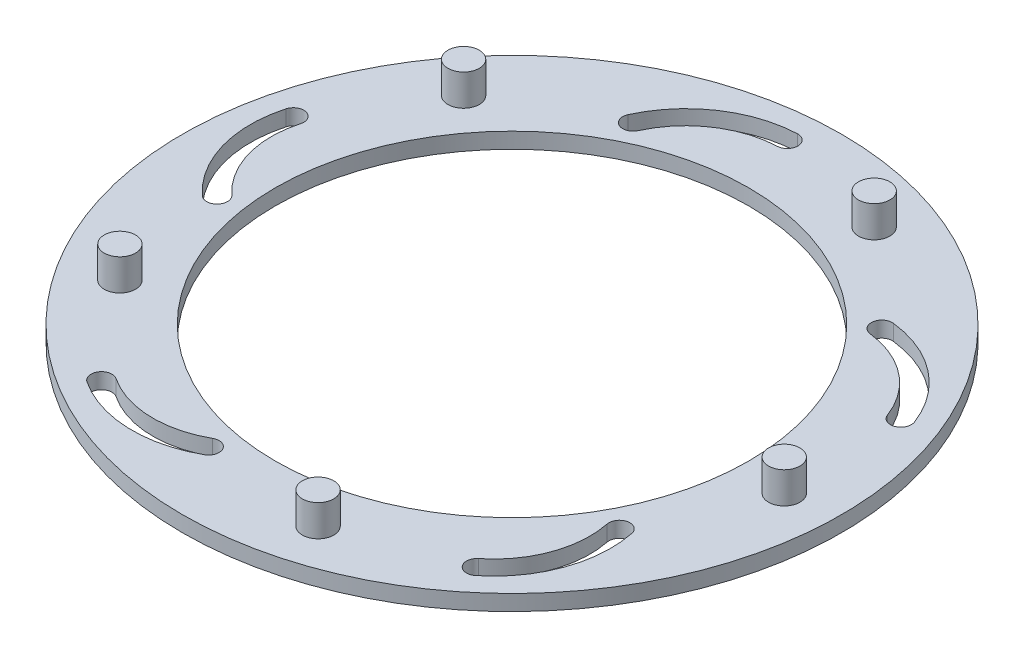
ISO-10303-21;
HEADER;
FILE_DESCRIPTION(('STEP AP214'),'2;1');
FILE_NAME('part.step','',(''),(''),'','','');
FILE_SCHEMA(('AUTOMOTIVE_DESIGN { 1 0 10303 214 1 1 1 1 }'));
ENDSEC;
DATA;
#1=APPLICATION_CONTEXT('core data for automotive mechanical design processes');
#2=APPLICATION_PROTOCOL_DEFINITION('international standard','automotive_design',2000,#1);
#3=PRODUCT_CONTEXT('',#1,'mechanical');
#4=PRODUCT('Part','Part','',(#3));
#5=PRODUCT_RELATED_PRODUCT_CATEGORY('part','',(#4));
#6=PRODUCT_DEFINITION_FORMATION('','',#4);
#7=PRODUCT_DEFINITION_CONTEXT('part definition',#1,'design');
#8=PRODUCT_DEFINITION('design','',#6,#7);
#9=PRODUCT_DEFINITION_SHAPE('','',#8);
#10=(LENGTH_UNIT() NAMED_UNIT(*) SI_UNIT(.MILLI.,.METRE.));
#11=(NAMED_UNIT(*) PLANE_ANGLE_UNIT() SI_UNIT($,.RADIAN.));
#12=(NAMED_UNIT(*) SI_UNIT($,.STERADIAN.) SOLID_ANGLE_UNIT());
#13=UNCERTAINTY_MEASURE_WITH_UNIT(LENGTH_MEASURE(1.E-05),#10,'distance_accuracy_value','');
#14=(GEOMETRIC_REPRESENTATION_CONTEXT(3) GLOBAL_UNCERTAINTY_ASSIGNED_CONTEXT((#13)) GLOBAL_UNIT_ASSIGNED_CONTEXT((#10,
#11,#12)) REPRESENTATION_CONTEXT('',''));
#15=CARTESIAN_POINT('',(0.,0.,0.));
#16=DIRECTION('',(0.,0.,1.));
#17=DIRECTION('',(1.,0.,0.));
#18=AXIS2_PLACEMENT_3D('',#15,#16,#17);
#19=CARTESIAN_POINT('',(-17.9080700913482,1.5,-4.05608746272835));
#20=DIRECTION('',(0.,-1.,0.));
#21=DIRECTION('',(0.,0.,-1.));
#22=AXIS2_PLACEMENT_3D('',#19,#20,#21);
#23=CYLINDRICAL_SURFACE('',#22,11.1486503347922);
#24=CARTESIAN_POINT('',(-17.9080700913482,0.,-4.05608746272835));
#25=DIRECTION('',(0.,1.,0.));
#26=DIRECTION('',(0.,0.,1.));
#27=AXIS2_PLACEMENT_3D('',#24,#25,#26);
#28=CIRCLE('',#27,11.1486503347922);
#29=CARTESIAN_POINT('',(-25.4396115620862,0.,4.16390568580991));
#30=VERTEX_POINT('',#29);
#31=CARTESIAN_POINT('',(-28.6472570750459,0.,-7.04979206015291));
#32=VERTEX_POINT('',#31);
#33=EDGE_CURVE('E288',#30,#32,#28,.F.);
#34=ORIENTED_EDGE('',*,*,#33,.T.);
#35=DIRECTION('',(0.,-1.,0.));
#36=VECTOR('',#35,1.);
#37=CARTESIAN_POINT('',(-28.6472570750459,1.5,-7.04979206015291));
#38=LINE('',#37,#36);
#39=CARTESIAN_POINT('',(-28.6472570750459,1.5,-7.04979206015291));
#40=VERTEX_POINT('',#39);
#41=EDGE_CURVE('E11',#40,#32,#38,.T.);
#42=ORIENTED_EDGE('',*,*,#41,.F.);
#43=CARTESIAN_POINT('',(-17.9080700913482,1.5,-4.05608746272835));
#44=DIRECTION('',(0.,1.,0.));
#45=DIRECTION('',(0.,0.,1.));
#46=AXIS2_PLACEMENT_3D('',#43,#44,#45);
#47=CIRCLE('',#46,11.1486503347922);
#48=CARTESIAN_POINT('',(-25.4396115620862,1.5,4.16390568580991));
#49=VERTEX_POINT('',#48);
#50=EDGE_CURVE('E194',#49,#40,#47,.F.);
#51=ORIENTED_EDGE('',*,*,#50,.F.);
#52=DIRECTION('',(0.,-1.,0.));
#53=VECTOR('',#52,1.);
#54=CARTESIAN_POINT('',(-25.4396115620862,1.5,4.16390568580991));
#55=LINE('',#54,#53);
#56=EDGE_CURVE('E61',#49,#30,#55,.T.);
#57=ORIENTED_EDGE('',*,*,#56,.T.);
#58=EDGE_LOOP('',(#34,#42,#51,#57));
#59=FACE_BOUND('',#58,.T.);
#60=ADVANCED_FACE('F41',(#59),#23,.F.);
#61=CARTESIAN_POINT('',(-27.6839846912863,1.5,-6.78126587020847));
#62=DIRECTION('',(0.,-1.,0.));
#63=DIRECTION('',(0.,0.,-1.));
#64=AXIS2_PLACEMENT_3D('',#61,#62,#63);
#65=CYLINDRICAL_SURFACE('',#64,1.);
#66=CARTESIAN_POINT('',(-27.6839846912863,0.,-6.78126587020847));
#67=DIRECTION('',(0.,1.,0.));
#68=DIRECTION('',(0.,0.,1.));
#69=AXIS2_PLACEMENT_3D('',#66,#67,#68);
#70=CIRCLE('',#69,1.);
#71=CARTESIAN_POINT('',(-26.7207123075267,0.,-6.51273968026403));
#72=VERTEX_POINT('',#71);
#73=EDGE_CURVE('E201',#32,#72,#70,.F.);
#74=ORIENTED_EDGE('',*,*,#73,.T.);
#75=DIRECTION('',(0.,-1.,0.));
#76=VECTOR('',#75,1.);
#77=CARTESIAN_POINT('',(-26.7207123075267,1.5,-6.51273968026403));
#78=LINE('',#77,#76);
#79=CARTESIAN_POINT('',(-26.7207123075267,1.5,-6.51273968026403));
#80=VERTEX_POINT('',#79);
#81=EDGE_CURVE('E52',#80,#72,#78,.T.);
#82=ORIENTED_EDGE('',*,*,#81,.F.);
#83=CARTESIAN_POINT('',(-27.6839846912863,1.5,-6.78126587020847));
#84=DIRECTION('',(0.,1.,0.));
#85=DIRECTION('',(0.,0.,1.));
#86=AXIS2_PLACEMENT_3D('',#83,#84,#85);
#87=CIRCLE('',#86,1.);
#88=EDGE_CURVE('E188',#40,#80,#87,.F.);
#89=ORIENTED_EDGE('',*,*,#88,.F.);
#90=ORIENTED_EDGE('',*,*,#41,.T.);
#91=EDGE_LOOP('',(#74,#82,#89,#90));
#92=FACE_BOUND('',#91,.T.);
#93=ADVANCED_FACE('F200',(#92),#65,.F.);
#94=CARTESIAN_POINT('',(-17.9080700913482,1.5,-4.05608746272835));
#95=DIRECTION('',(0.,-1.,0.));
#96=DIRECTION('',(0.,0.,-1.));
#97=AXIS2_PLACEMENT_3D('',#94,#95,#96);
#98=CYLINDRICAL_SURFACE('',#97,9.1486503347922);
#99=CARTESIAN_POINT('',(-17.9080700913482,0.,-4.05608746272835));
#100=DIRECTION('',(0.,1.,0.));
#101=DIRECTION('',(0.,0.,1.));
#102=AXIS2_PLACEMENT_3D('',#99,#100,#101);
#103=CIRCLE('',#102,9.1486503347922);
#104=CARTESIAN_POINT('',(-24.0884988722867,0.,2.68928895612637));
#105=VERTEX_POINT('',#104);
#106=EDGE_CURVE('E293',#105,#72,#103,.F.);
#107=ORIENTED_EDGE('',*,*,#106,.F.);
#108=DIRECTION('',(0.,-1.,0.));
#109=VECTOR('',#108,1.);
#110=CARTESIAN_POINT('',(-24.0884988722867,1.5,2.68928895612637));
#111=LINE('',#110,#109);
#112=CARTESIAN_POINT('',(-24.0884988722867,1.5,2.68928895612637));
#113=VERTEX_POINT('',#112);
#114=EDGE_CURVE('E123',#113,#105,#111,.T.);
#115=ORIENTED_EDGE('',*,*,#114,.F.);
#116=CARTESIAN_POINT('',(-17.9080700913482,1.5,-4.05608746272835));
#117=DIRECTION('',(0.,1.,0.));
#118=DIRECTION('',(0.,0.,1.));
#119=AXIS2_PLACEMENT_3D('',#116,#117,#118);
#120=CIRCLE('',#119,9.1486503347922);
#121=EDGE_CURVE('E193',#113,#80,#120,.F.);
#122=ORIENTED_EDGE('',*,*,#121,.T.);
#123=ORIENTED_EDGE('',*,*,#81,.T.);
#124=EDGE_LOOP('',(#107,#115,#122,#123));
#125=FACE_BOUND('',#124,.T.);
#126=ADVANCED_FACE('F206',(#125),#98,.T.);
#127=CARTESIAN_POINT('',(-9.39146640677339,1.5,15.7781867979949));
#128=DIRECTION('',(0.,-1.,0.));
#129=DIRECTION('',(0.,0.,-1.));
#130=AXIS2_PLACEMENT_3D('',#127,#128,#129);
#131=CYLINDRICAL_SURFACE('',#130,11.1486503347922);
#132=CARTESIAN_POINT('',(-9.39146640677339,0.,15.7781867979949));
#133=DIRECTION('',(0.,1.,0.));
#134=DIRECTION('',(0.,0.,1.));
#135=AXIS2_PLACEMENT_3D('',#132,#133,#134);
#136=CIRCLE('',#135,11.1486503347922);
#137=CARTESIAN_POINT('',(-3.90116266725228,0.,25.4812259680315));
#138=VERTEX_POINT('',#137);
#139=CARTESIAN_POINT('',(-15.5572399557496,0.,25.0666549618101));
#140=VERTEX_POINT('',#139);
#141=EDGE_CURVE('E272',#138,#140,#136,.F.);
#142=ORIENTED_EDGE('',*,*,#141,.T.);
#143=DIRECTION('',(0.,-1.,0.));
#144=VECTOR('',#143,1.);
#145=CARTESIAN_POINT('',(-15.5572399557496,1.5,25.0666549618101));
#146=LINE('',#145,#144);
#147=CARTESIAN_POINT('',(-15.5572399557496,1.5,25.0666549618101));
#148=VERTEX_POINT('',#147);
#149=EDGE_CURVE('E303',#148,#140,#146,.T.);
#150=ORIENTED_EDGE('',*,*,#149,.F.);
#151=CARTESIAN_POINT('',(-9.39146640677339,1.5,15.7781867979949));
#152=DIRECTION('',(0.,1.,0.));
#153=DIRECTION('',(0.,0.,1.));
#154=AXIS2_PLACEMENT_3D('',#151,#152,#153);
#155=CIRCLE('',#154,11.1486503347922);
#156=CARTESIAN_POINT('',(-3.90116266725228,1.5,25.4812259680315));
#157=VERTEX_POINT('',#156);
#158=EDGE_CURVE('E781',#157,#148,#155,.F.);
#159=ORIENTED_EDGE('',*,*,#158,.F.);
#160=DIRECTION('',(0.,-1.,0.));
#161=VECTOR('',#160,1.);
#162=CARTESIAN_POINT('',(-3.90116266725228,1.5,25.4812259680315));
#163=LINE('',#162,#161);
#164=EDGE_CURVE('E306',#157,#138,#163,.T.);
#165=ORIENTED_EDGE('',*,*,#164,.T.);
#166=EDGE_LOOP('',(#142,#150,#159,#165));
#167=FACE_BOUND('',#166,.T.);
#168=ADVANCED_FACE('F399',(#167),#131,.F.);
#169=CARTESIAN_POINT('',(-15.0041888362132,1.5,24.2335076403959));
#170=DIRECTION('',(0.,-1.,0.));
#171=DIRECTION('',(0.,0.,-1.));
#172=AXIS2_PLACEMENT_3D('',#169,#170,#171);
#173=CYLINDRICAL_SURFACE('',#172,1.);
#174=CARTESIAN_POINT('',(-15.0041888362132,0.,24.2335076403959));
#175=DIRECTION('',(0.,1.,0.));
#176=DIRECTION('',(0.,0.,1.));
#177=AXIS2_PLACEMENT_3D('',#174,#175,#176);
#178=CIRCLE('',#177,1.);
#179=CARTESIAN_POINT('',(-14.4511377166769,0.,23.4003603189818));
#180=VERTEX_POINT('',#179);
#181=EDGE_CURVE('E276',#140,#180,#178,.F.);
#182=ORIENTED_EDGE('',*,*,#181,.T.);
#183=DIRECTION('',(0.,-1.,0.));
#184=VECTOR('',#183,1.);
#185=CARTESIAN_POINT('',(-14.4511377166769,1.5,23.4003603189818));
#186=LINE('',#185,#184);
#187=CARTESIAN_POINT('',(-14.4511377166769,1.5,23.4003603189818));
#188=VERTEX_POINT('',#187);
#189=EDGE_CURVE('E313',#188,#180,#186,.T.);
#190=ORIENTED_EDGE('',*,*,#189,.F.);
#191=CARTESIAN_POINT('',(-15.0041888362132,1.5,24.2335076403959));
#192=DIRECTION('',(0.,1.,0.));
#193=DIRECTION('',(0.,0.,1.));
#194=AXIS2_PLACEMENT_3D('',#191,#192,#193);
#195=CIRCLE('',#194,1.);
#196=EDGE_CURVE('E785',#148,#188,#195,.F.);
#197=ORIENTED_EDGE('',*,*,#196,.F.);
#198=ORIENTED_EDGE('',*,*,#149,.T.);
#199=EDGE_LOOP('',(#182,#190,#197,#198));
#200=FACE_BOUND('',#199,.T.);
#201=ADVANCED_FACE('F395',(#200),#173,.F.);
#202=CARTESIAN_POINT('',(-9.39146640677339,1.5,15.7781867979949));
#203=DIRECTION('',(0.,-1.,0.));
#204=DIRECTION('',(0.,0.,-1.));
#205=AXIS2_PLACEMENT_3D('',#202,#203,#204);
#206=CYLINDRICAL_SURFACE('',#205,9.1486503347922);
#207=CARTESIAN_POINT('',(-9.39146640677339,0.,15.7781867979949));
#208=DIRECTION('',(0.,1.,0.));
#209=DIRECTION('',(0.,0.,1.));
#210=AXIS2_PLACEMENT_3D('',#207,#208,#209);
#211=CIRCLE('',#210,9.1486503347922);
#212=CARTESIAN_POINT('',(-4.88608973459195,0.,23.7405598104867));
#213=VERTEX_POINT('',#212);
#214=EDGE_CURVE('E280',#213,#180,#211,.F.);
#215=ORIENTED_EDGE('',*,*,#214,.F.);
#216=DIRECTION('',(0.,-1.,0.));
#217=VECTOR('',#216,1.);
#218=CARTESIAN_POINT('',(-4.88608973459195,1.5,23.7405598104867));
#219=LINE('',#218,#217);
#220=CARTESIAN_POINT('',(-4.88608973459195,1.5,23.7405598104867));
#221=VERTEX_POINT('',#220);
#222=EDGE_CURVE('E309',#221,#213,#219,.T.);
#223=ORIENTED_EDGE('',*,*,#222,.F.);
#224=CARTESIAN_POINT('',(-9.39146640677339,1.5,15.7781867979949));
#225=DIRECTION('',(0.,1.,0.));
#226=DIRECTION('',(0.,0.,1.));
#227=AXIS2_PLACEMENT_3D('',#224,#225,#226);
#228=CIRCLE('',#227,9.1486503347922);
#229=EDGE_CURVE('E788',#221,#188,#228,.F.);
#230=ORIENTED_EDGE('',*,*,#229,.T.);
#231=ORIENTED_EDGE('',*,*,#189,.T.);
#232=EDGE_LOOP('',(#215,#223,#230,#231));
#233=FACE_BOUND('',#232,.T.);
#234=ADVANCED_FACE('F391',(#233),#206,.T.);
#235=CARTESIAN_POINT('',(12.1038246477627,1.5,13.8075431847338));
#236=DIRECTION('',(0.,-1.,0.));
#237=DIRECTION('',(0.,0.,-1.));
#238=AXIS2_PLACEMENT_3D('',#235,#236,#237);
#239=CYLINDRICAL_SURFACE('',#238,11.1486503347922);
#240=CARTESIAN_POINT('',(12.1038246477627,0.,13.8075431847338));
#241=DIRECTION('',(0.,1.,0.));
#242=DIRECTION('',(0.,0.,1.));
#243=AXIS2_PLACEMENT_3D('',#240,#241,#242);
#244=CIRCLE('',#243,11.1486503347922);
#245=CARTESIAN_POINT('',(23.0285604380854,0.,11.5843580374497));
#246=VERTEX_POINT('',#245);
#247=CARTESIAN_POINT('',(19.032354011258,0.,22.5418368108175));
#248=VERTEX_POINT('',#247);
#249=EDGE_CURVE('E256',#246,#248,#244,.F.);
#250=ORIENTED_EDGE('',*,*,#249,.T.);
#251=DIRECTION('',(0.,-1.,0.));
#252=VECTOR('',#251,1.);
#253=CARTESIAN_POINT('',(19.032354011258,1.5,22.5418368108175));
#254=LINE('',#253,#252);
#255=CARTESIAN_POINT('',(19.032354011258,1.5,22.5418368108175));
#256=VERTEX_POINT('',#255);
#257=EDGE_CURVE('E310',#256,#248,#254,.T.);
#258=ORIENTED_EDGE('',*,*,#257,.F.);
#259=CARTESIAN_POINT('',(12.1038246477627,1.5,13.8075431847338));
#260=DIRECTION('',(0.,1.,0.));
#261=DIRECTION('',(0.,0.,1.));
#262=AXIS2_PLACEMENT_3D('',#259,#260,#261);
#263=CIRCLE('',#262,11.1486503347922);
#264=CARTESIAN_POINT('',(23.0285604380854,1.5,11.5843580374497));
#265=VERTEX_POINT('',#264);
#266=EDGE_CURVE('E766',#265,#256,#263,.F.);
#267=ORIENTED_EDGE('',*,*,#266,.F.);
#268=DIRECTION('',(0.,-1.,0.));
#269=VECTOR('',#268,1.);
#270=CARTESIAN_POINT('',(23.0285604380854,1.5,11.5843580374497));
#271=LINE('',#270,#269);
#272=EDGE_CURVE('E319',#265,#246,#271,.T.);
#273=ORIENTED_EDGE('',*,*,#272,.T.);
#274=EDGE_LOOP('',(#250,#258,#267,#273));
#275=FACE_BOUND('',#274,.T.);
#276=ADVANCED_FACE('F394',(#275),#239,.F.);
#277=CARTESIAN_POINT('',(18.410886016888,1.5,21.7583972586031));
#278=DIRECTION('',(0.,-1.,0.));
#279=DIRECTION('',(0.,0.,-1.));
#280=AXIS2_PLACEMENT_3D('',#277,#278,#279);
#281=CYLINDRICAL_SURFACE('',#280,1.);
#282=CARTESIAN_POINT('',(18.410886016888,0.,21.7583972586031));
#283=DIRECTION('',(0.,1.,0.));
#284=DIRECTION('',(0.,0.,1.));
#285=AXIS2_PLACEMENT_3D('',#282,#283,#284);
#286=CIRCLE('',#285,1.);
#287=CARTESIAN_POINT('',(17.789418022518,0.,20.9749577063888));
#288=VERTEX_POINT('',#287);
#289=EDGE_CURVE('E260',#248,#288,#286,.F.);
#290=ORIENTED_EDGE('',*,*,#289,.T.);
#291=DIRECTION('',(0.,-1.,0.));
#292=VECTOR('',#291,1.);
#293=CARTESIAN_POINT('',(17.789418022518,1.5,20.9749577063888));
#294=LINE('',#293,#292);
#295=CARTESIAN_POINT('',(17.789418022518,1.5,20.9749577063888));
#296=VERTEX_POINT('',#295);
#297=EDGE_CURVE('E326',#296,#288,#294,.T.);
#298=ORIENTED_EDGE('',*,*,#297,.F.);
#299=CARTESIAN_POINT('',(18.410886016888,1.5,21.7583972586031));
#300=DIRECTION('',(0.,1.,0.));
#301=DIRECTION('',(0.,0.,1.));
#302=AXIS2_PLACEMENT_3D('',#299,#300,#301);
#303=CIRCLE('',#302,1.);
#304=EDGE_CURVE('E770',#256,#296,#303,.F.);
#305=ORIENTED_EDGE('',*,*,#304,.F.);
#306=ORIENTED_EDGE('',*,*,#257,.T.);
#307=EDGE_LOOP('',(#290,#298,#305,#306));
#308=FACE_BOUND('',#307,.T.);
#309=ADVANCED_FACE('F412',(#308),#281,.F.);
#310=CARTESIAN_POINT('',(12.1038246477627,1.5,13.8075431847338));
#311=DIRECTION('',(0.,-1.,0.));
#312=DIRECTION('',(0.,0.,-1.));
#313=AXIS2_PLACEMENT_3D('',#310,#311,#312);
#314=CYLINDRICAL_SURFACE('',#313,9.14865033479221);
#315=CARTESIAN_POINT('',(12.1038246477627,0.,13.8075431847338));
#316=DIRECTION('',(0.,1.,0.));
#317=DIRECTION('',(0.,0.,1.));
#318=AXIS2_PLACEMENT_3D('',#315,#316,#317);
#319=CIRCLE('',#318,9.14865033479221);
#320=CARTESIAN_POINT('',(21.0687293442301,0.,11.9831839187039));
#321=VERTEX_POINT('',#320);
#322=EDGE_CURVE('E264',#321,#288,#319,.F.);
#323=ORIENTED_EDGE('',*,*,#322,.F.);
#324=DIRECTION('',(0.,-1.,0.));
#325=VECTOR('',#324,1.);
#326=CARTESIAN_POINT('',(21.0687293442301,1.5,11.9831839187039));
#327=LINE('',#326,#325);
#328=CARTESIAN_POINT('',(21.0687293442301,1.5,11.9831839187039));
#329=VERTEX_POINT('',#328);
#330=EDGE_CURVE('E322',#329,#321,#327,.T.);
#331=ORIENTED_EDGE('',*,*,#330,.F.);
#332=CARTESIAN_POINT('',(12.1038246477627,1.5,13.8075431847338));
#333=DIRECTION('',(0.,1.,0.));
#334=DIRECTION('',(0.,0.,1.));
#335=AXIS2_PLACEMENT_3D('',#332,#333,#334);
#336=CIRCLE('',#335,9.14865033479221);
#337=EDGE_CURVE('E773',#329,#296,#336,.F.);
#338=ORIENTED_EDGE('',*,*,#337,.T.);
#339=ORIENTED_EDGE('',*,*,#297,.T.);
#340=EDGE_LOOP('',(#323,#331,#338,#339));
#341=FACE_BOUND('',#340,.T.);
#342=ADVANCED_FACE('F408',(#341),#314,.T.);
#343=CARTESIAN_POINT('',(16.8720414329627,1.5,-7.24465580869776));
#344=DIRECTION('',(0.,-1.,0.));
#345=DIRECTION('',(0.,0.,-1.));
#346=AXIS2_PLACEMENT_3D('',#343,#344,#345);
#347=CYLINDRICAL_SURFACE('',#346,11.1486503347922);
#348=CARTESIAN_POINT('',(16.8720414329627,0.,-7.24465580869776));
#349=DIRECTION('',(0.,1.,0.));
#350=DIRECTION('',(0.,0.,1.));
#351=AXIS2_PLACEMENT_3D('',#348,#349,#350);
#352=CIRCLE('',#351,11.1486503347922);
#353=CARTESIAN_POINT('',(18.1335957299734,0.,-18.3216989630398));
#354=VERTEX_POINT('',#353);
#355=CARTESIAN_POINT('',(27.3198816206306,0.,-11.1350336438717));
#356=VERTEX_POINT('',#355);
#357=EDGE_CURVE('E240',#354,#356,#352,.F.);
#358=ORIENTED_EDGE('',*,*,#357,.T.);
#359=DIRECTION('',(0.,-1.,0.));
#360=VECTOR('',#359,1.);
#361=CARTESIAN_POINT('',(27.3198816206306,1.5,-11.1350336438717));
#362=LINE('',#361,#360);
#363=CARTESIAN_POINT('',(27.3198816206306,1.5,-11.1350336438717));
#364=VERTEX_POINT('',#363);
#365=EDGE_CURVE('E323',#364,#356,#362,.T.);
#366=ORIENTED_EDGE('',*,*,#365,.F.);
#367=CARTESIAN_POINT('',(16.8720414329627,1.5,-7.24465580869776));
#368=DIRECTION('',(0.,1.,0.));
#369=DIRECTION('',(0.,0.,1.));
#370=AXIS2_PLACEMENT_3D('',#367,#368,#369);
#371=CIRCLE('',#370,11.1486503347922);
#372=CARTESIAN_POINT('',(18.1335957299734,1.5,-18.3216989630398));
#373=VERTEX_POINT('',#372);
#374=EDGE_CURVE('E751',#373,#364,#371,.F.);
#375=ORIENTED_EDGE('',*,*,#374,.F.);
#376=DIRECTION('',(0.,-1.,0.));
#377=VECTOR('',#376,1.);
#378=CARTESIAN_POINT('',(18.1335957299734,1.5,-18.3216989630398));
#379=LINE('',#378,#377);
#380=EDGE_CURVE('E332',#373,#354,#379,.T.);
#381=ORIENTED_EDGE('',*,*,#380,.T.);
#382=EDGE_LOOP('',(#358,#366,#375,#381));
#383=FACE_BOUND('',#382,.T.);
#384=ADVANCED_FACE('F411',(#383),#347,.F.);
#385=CARTESIAN_POINT('',(26.3827421576534,1.5,-10.7860785938569));
#386=DIRECTION('',(0.,-1.,0.));
#387=DIRECTION('',(0.,0.,-1.));
#388=AXIS2_PLACEMENT_3D('',#385,#386,#387);
#389=CYLINDRICAL_SURFACE('',#388,1.);
#390=CARTESIAN_POINT('',(26.3827421576534,0.,-10.7860785938569));
#391=DIRECTION('',(0.,1.,0.));
#392=DIRECTION('',(0.,0.,1.));
#393=AXIS2_PLACEMENT_3D('',#390,#391,#392);
#394=CIRCLE('',#393,1.);
#395=CARTESIAN_POINT('',(25.4456026946762,0.,-10.4371235438422));
#396=VERTEX_POINT('',#395);
#397=EDGE_CURVE('E244',#356,#396,#394,.F.);
#398=ORIENTED_EDGE('',*,*,#397,.T.);
#399=DIRECTION('',(0.,-1.,0.));
#400=VECTOR('',#399,1.);
#401=CARTESIAN_POINT('',(25.4456026946762,1.5,-10.4371235438422));
#402=LINE('',#401,#400);
#403=CARTESIAN_POINT('',(25.4456026946762,1.5,-10.4371235438422));
#404=VERTEX_POINT('',#403);
#405=EDGE_CURVE('E338',#404,#396,#402,.T.);
#406=ORIENTED_EDGE('',*,*,#405,.F.);
#407=CARTESIAN_POINT('',(26.3827421576534,1.5,-10.7860785938569));
#408=DIRECTION('',(0.,1.,0.));
#409=DIRECTION('',(0.,0.,1.));
#410=AXIS2_PLACEMENT_3D('',#407,#408,#409);
#411=CIRCLE('',#410,1.);
#412=EDGE_CURVE('E755',#364,#404,#411,.F.);
#413=ORIENTED_EDGE('',*,*,#412,.F.);
#414=ORIENTED_EDGE('',*,*,#365,.T.);
#415=EDGE_LOOP('',(#398,#406,#413,#414));
#416=FACE_BOUND('',#415,.T.);
#417=ADVANCED_FACE('F426',(#416),#389,.F.);
#418=CARTESIAN_POINT('',(16.8720414329627,1.5,-7.24465580869776));
#419=DIRECTION('',(0.,-1.,0.));
#420=DIRECTION('',(0.,0.,-1.));
#421=AXIS2_PLACEMENT_3D('',#418,#419,#420);
#422=CYLINDRICAL_SURFACE('',#421,9.1486503347922);
#423=CARTESIAN_POINT('',(16.8720414329627,0.,-7.24465580869776));
#424=DIRECTION('',(0.,1.,0.));
#425=DIRECTION('',(0.,0.,1.));
#426=AXIS2_PLACEMENT_3D('',#423,#424,#425);
#427=CIRCLE('',#426,9.1486503347922);
#428=CARTESIAN_POINT('',(17.9072805691017,0.,-16.3345448552868));
#429=VERTEX_POINT('',#428);
#430=EDGE_CURVE('E248',#429,#396,#427,.F.);
#431=ORIENTED_EDGE('',*,*,#430,.F.);
#432=DIRECTION('',(0.,-1.,0.));
#433=VECTOR('',#432,1.);
#434=CARTESIAN_POINT('',(17.9072805691017,1.5,-16.3345448552868));
#435=LINE('',#434,#433);
#436=CARTESIAN_POINT('',(17.9072805691017,1.5,-16.3345448552868));
#437=VERTEX_POINT('',#436);
#438=EDGE_CURVE('E335',#437,#429,#435,.T.);
#439=ORIENTED_EDGE('',*,*,#438,.F.);
#440=CARTESIAN_POINT('',(16.8720414329627,1.5,-7.24465580869776));
#441=DIRECTION('',(0.,1.,0.));
#442=DIRECTION('',(0.,0.,1.));
#443=AXIS2_PLACEMENT_3D('',#440,#441,#442);
#444=CIRCLE('',#443,9.1486503347922);
#445=EDGE_CURVE('E758',#437,#404,#444,.F.);
#446=ORIENTED_EDGE('',*,*,#445,.T.);
#447=ORIENTED_EDGE('',*,*,#405,.T.);
#448=EDGE_LOOP('',(#431,#439,#446,#447));
#449=FACE_BOUND('',#448,.T.);
#450=ADVANCED_FACE('F423',(#449),#422,.T.);
#451=CARTESIAN_POINT('',(-1.67632958259202,1.5,-18.2849867113037));
#452=DIRECTION('',(0.,-1.,0.));
#453=DIRECTION('',(0.,0.,-1.));
#454=AXIS2_PLACEMENT_3D('',#451,#452,#453);
#455=CYLINDRICAL_SURFACE('',#454,11.1486503347922);
#456=CARTESIAN_POINT('',(-1.67632958259202,0.,-18.2849867113037));
#457=DIRECTION('',(0.,1.,0.));
#458=DIRECTION('',(0.,0.,1.));
#459=AXIS2_PLACEMENT_3D('',#456,#457,#458);
#460=CIRCLE('',#459,11.1486503347922);
#461=CARTESIAN_POINT('',(-11.8213819387086,0.,-22.9077907282523));
#462=VERTEX_POINT('',#461);
#463=CARTESIAN_POINT('',(-2.14773860108144,0.,-29.423666068604));
#464=VERTEX_POINT('',#463);
#465=EDGE_CURVE('E224',#462,#464,#460,.F.);
#466=ORIENTED_EDGE('',*,*,#465,.T.);
#467=DIRECTION('',(0.,-1.,0.));
#468=VECTOR('',#467,1.);
#469=CARTESIAN_POINT('',(-2.14773860108144,1.5,-29.423666068604));
#470=LINE('',#469,#468);
#471=CARTESIAN_POINT('',(-2.14773860108144,1.5,-29.423666068604));
#472=VERTEX_POINT('',#471);
#473=EDGE_CURVE('E45',#472,#464,#470,.T.);
#474=ORIENTED_EDGE('',*,*,#473,.F.);
#475=CARTESIAN_POINT('',(-1.67632958259202,1.5,-18.2849867113037));
#476=DIRECTION('',(0.,1.,0.));
#477=DIRECTION('',(0.,0.,1.));
#478=AXIS2_PLACEMENT_3D('',#475,#476,#477);
#479=CIRCLE('',#478,11.1486503347922);
#480=CARTESIAN_POINT('',(-11.8213819387086,1.5,-22.9077907282523));
#481=VERTEX_POINT('',#480);
#482=EDGE_CURVE('E741',#481,#472,#479,.F.);
#483=ORIENTED_EDGE('',*,*,#482,.F.);
#484=DIRECTION('',(0.,-1.,0.));
#485=VECTOR('',#484,1.);
#486=CARTESIAN_POINT('',(-11.8213819387086,1.5,-22.9077907282523));
#487=LINE('',#486,#485);
#488=EDGE_CURVE('E211',#481,#462,#487,.T.);
#489=ORIENTED_EDGE('',*,*,#488,.T.);
#490=EDGE_LOOP('',(#466,#474,#483,#489));
#491=FACE_BOUND('',#490,.T.);
#492=ADVANCED_FACE('F359',(#491),#455,.F.);
#493=CARTESIAN_POINT('',(-2.10545464703022,1.5,-28.4245604349347));
#494=DIRECTION('',(0.,-1.,0.));
#495=DIRECTION('',(0.,0.,-1.));
#496=AXIS2_PLACEMENT_3D('',#493,#494,#495);
#497=CYLINDRICAL_SURFACE('',#496,1.);
#498=CARTESIAN_POINT('',(-2.10545464703022,0.,-28.4245604349347));
#499=DIRECTION('',(0.,1.,0.));
#500=DIRECTION('',(0.,0.,1.));
#501=AXIS2_PLACEMENT_3D('',#498,#499,#500);
#502=CIRCLE('',#501,1.);
#503=CARTESIAN_POINT('',(-2.06317069297901,0.,-27.4254548012654));
#504=VERTEX_POINT('',#503);
#505=EDGE_CURVE('E228',#464,#504,#502,.F.);
#506=ORIENTED_EDGE('',*,*,#505,.T.);
#507=DIRECTION('',(0.,-1.,0.));
#508=VECTOR('',#507,1.);
#509=CARTESIAN_POINT('',(-2.06317069297901,1.5,-27.4254548012654));
#510=LINE('',#509,#508);
#511=CARTESIAN_POINT('',(-2.06317069297901,1.5,-27.4254548012654));
#512=VERTEX_POINT('',#511);
#513=EDGE_CURVE('E348',#512,#504,#510,.T.);
#514=ORIENTED_EDGE('',*,*,#513,.F.);
#515=CARTESIAN_POINT('',(-2.10545464703022,1.5,-28.4245604349347));
#516=DIRECTION('',(0.,1.,0.));
#517=DIRECTION('',(0.,0.,1.));
#518=AXIS2_PLACEMENT_3D('',#515,#516,#517);
#519=CIRCLE('',#518,1.);
#520=EDGE_CURVE('E136',#472,#512,#519,.F.);
#521=ORIENTED_EDGE('',*,*,#520,.F.);
#522=ORIENTED_EDGE('',*,*,#473,.T.);
#523=EDGE_LOOP('',(#506,#514,#521,#522));
#524=FACE_BOUND('',#523,.T.);
#525=ADVANCED_FACE('F355',(#524),#497,.F.);
#526=CARTESIAN_POINT('',(-1.67632958259202,1.5,-18.2849867113037));
#527=DIRECTION('',(0.,-1.,0.));
#528=DIRECTION('',(0.,0.,-1.));
#529=AXIS2_PLACEMENT_3D('',#526,#527,#528);
#530=CYLINDRICAL_SURFACE('',#529,9.1486503347922);
#531=CARTESIAN_POINT('',(-1.67632958259202,0.,-18.2849867113037));
#532=DIRECTION('',(0.,1.,0.));
#533=DIRECTION('',(0.,0.,1.));
#534=AXIS2_PLACEMENT_3D('',#531,#532,#533);
#535=CIRCLE('',#534,9.1486503347922);
#536=CARTESIAN_POINT('',(-10.0014213064415,0.,-22.0784878300311));
#537=VERTEX_POINT('',#536);
#538=EDGE_CURVE('E232',#537,#504,#535,.F.);
#539=ORIENTED_EDGE('',*,*,#538,.F.);
#540=DIRECTION('',(0.,-1.,0.));
#541=VECTOR('',#540,1.);
#542=CARTESIAN_POINT('',(-10.0014213064415,1.5,-22.0784878300311));
#543=LINE('',#542,#541);
#544=CARTESIAN_POINT('',(-10.0014213064415,1.5,-22.0784878300311));
#545=VERTEX_POINT('',#544);
#546=EDGE_CURVE('E346',#545,#537,#543,.T.);
#547=ORIENTED_EDGE('',*,*,#546,.F.);
#548=CARTESIAN_POINT('',(-1.67632958259202,1.5,-18.2849867113037));
#549=DIRECTION('',(0.,1.,0.));
#550=DIRECTION('',(0.,0.,1.));
#551=AXIS2_PLACEMENT_3D('',#548,#549,#550);
#552=CIRCLE('',#551,9.1486503347922);
#553=EDGE_CURVE('E746',#545,#512,#552,.F.);
#554=ORIENTED_EDGE('',*,*,#553,.T.);
#555=ORIENTED_EDGE('',*,*,#513,.T.);
#556=EDGE_LOOP('',(#539,#547,#554,#555));
#557=FACE_BOUND('',#556,.T.);
#558=ADVANCED_FACE('F370',(#557),#530,.T.);
#559=CARTESIAN_POINT('',(-4.39362620092211,1.5,24.6108928892591));
#560=DIRECTION('',(0.,-1.,0.));
#561=DIRECTION('',(0.,0.,-1.));
#562=AXIS2_PLACEMENT_3D('',#559,#560,#561);
#563=CYLINDRICAL_SURFACE('',#562,1.);
#564=CARTESIAN_POINT('',(-4.39362620092211,0.,24.6108928892591));
#565=DIRECTION('',(0.,1.,0.));
#566=DIRECTION('',(0.,0.,1.));
#567=AXIS2_PLACEMENT_3D('',#564,#565,#566);
#568=CIRCLE('',#567,1.);
#569=EDGE_CURVE('E284',#138,#213,#568,.T.);
#570=ORIENTED_EDGE('',*,*,#569,.F.);
#571=ORIENTED_EDGE('',*,*,#164,.F.);
#572=CARTESIAN_POINT('',(-4.39362620092211,1.5,24.6108928892591));
#573=DIRECTION('',(0.,1.,0.));
#574=DIRECTION('',(0.,0.,1.));
#575=AXIS2_PLACEMENT_3D('',#572,#573,#574);
#576=CIRCLE('',#575,1.);
#577=EDGE_CURVE('E792',#157,#221,#576,.T.);
#578=ORIENTED_EDGE('',*,*,#577,.T.);
#579=ORIENTED_EDGE('',*,*,#222,.T.);
#580=EDGE_LOOP('',(#570,#571,#578,#579));
#581=FACE_BOUND('',#580,.T.);
#582=ADVANCED_FACE('F372',(#581),#563,.F.);
#583=CARTESIAN_POINT('',(22.0486448911577,1.5,11.7837709780768));
#584=DIRECTION('',(0.,-1.,0.));
#585=DIRECTION('',(0.,0.,-1.));
#586=AXIS2_PLACEMENT_3D('',#583,#584,#585);
#587=CYLINDRICAL_SURFACE('',#586,1.);
#588=CARTESIAN_POINT('',(22.0486448911577,0.,11.7837709780768));
#589=DIRECTION('',(0.,1.,0.));
#590=DIRECTION('',(0.,0.,1.));
#591=AXIS2_PLACEMENT_3D('',#588,#589,#590);
#592=CIRCLE('',#591,1.);
#593=EDGE_CURVE('E268',#246,#321,#592,.T.);
#594=ORIENTED_EDGE('',*,*,#593,.F.);
#595=ORIENTED_EDGE('',*,*,#272,.F.);
#596=CARTESIAN_POINT('',(22.0486448911577,1.5,11.7837709780768));
#597=DIRECTION('',(0.,1.,0.));
#598=DIRECTION('',(0.,0.,1.));
#599=AXIS2_PLACEMENT_3D('',#596,#597,#598);
#600=CIRCLE('',#599,1.);
#601=EDGE_CURVE('E777',#265,#329,#600,.T.);
#602=ORIENTED_EDGE('',*,*,#601,.T.);
#603=ORIENTED_EDGE('',*,*,#330,.T.);
#604=EDGE_LOOP('',(#594,#595,#602,#603));
#605=FACE_BOUND('',#604,.T.);
#606=ADVANCED_FACE('F378',(#605),#587,.F.);
#607=CARTESIAN_POINT('',(18.0204381495375,1.5,-17.3281219091633));
#608=DIRECTION('',(0.,-1.,0.));
#609=DIRECTION('',(0.,0.,-1.));
#610=AXIS2_PLACEMENT_3D('',#607,#608,#609);
#611=CYLINDRICAL_SURFACE('',#610,1.);
#612=CARTESIAN_POINT('',(18.0204381495375,0.,-17.3281219091633));
#613=DIRECTION('',(0.,1.,0.));
#614=DIRECTION('',(0.,0.,1.));
#615=AXIS2_PLACEMENT_3D('',#612,#613,#614);
#616=CIRCLE('',#615,1.);
#617=EDGE_CURVE('E252',#354,#429,#616,.T.);
#618=ORIENTED_EDGE('',*,*,#617,.F.);
#619=ORIENTED_EDGE('',*,*,#380,.F.);
#620=CARTESIAN_POINT('',(18.0204381495375,1.5,-17.3281219091633));
#621=DIRECTION('',(0.,1.,0.));
#622=DIRECTION('',(0.,0.,1.));
#623=AXIS2_PLACEMENT_3D('',#620,#621,#622);
#624=CIRCLE('',#623,1.);
#625=EDGE_CURVE('E762',#373,#437,#624,.T.);
#626=ORIENTED_EDGE('',*,*,#625,.T.);
#627=ORIENTED_EDGE('',*,*,#438,.T.);
#628=EDGE_LOOP('',(#618,#619,#626,#627));
#629=FACE_BOUND('',#628,.T.);
#630=ADVANCED_FACE('F406',(#629),#611,.F.);
#631=CARTESIAN_POINT('',(-10.911401622575,1.5,-22.4931392791417));
#632=DIRECTION('',(0.,-1.,0.));
#633=DIRECTION('',(0.,0.,-1.));
#634=AXIS2_PLACEMENT_3D('',#631,#632,#633);
#635=CYLINDRICAL_SURFACE('',#634,1.);
#636=CARTESIAN_POINT('',(-10.911401622575,0.,-22.4931392791417));
#637=DIRECTION('',(0.,1.,0.));
#638=DIRECTION('',(0.,0.,1.));
#639=AXIS2_PLACEMENT_3D('',#636,#637,#638);
#640=CIRCLE('',#639,1.);
#641=EDGE_CURVE('E236',#462,#537,#640,.T.);
#642=ORIENTED_EDGE('',*,*,#641,.F.);
#643=ORIENTED_EDGE('',*,*,#488,.F.);
#644=CARTESIAN_POINT('',(-10.911401622575,1.5,-22.4931392791417));
#645=DIRECTION('',(0.,1.,0.));
#646=DIRECTION('',(0.,0.,1.));
#647=AXIS2_PLACEMENT_3D('',#644,#645,#646);
#648=CIRCLE('',#647,1.);
#649=EDGE_CURVE('E368',#481,#545,#648,.T.);
#650=ORIENTED_EDGE('',*,*,#649,.T.);
#651=ORIENTED_EDGE('',*,*,#546,.T.);
#652=EDGE_LOOP('',(#642,#643,#650,#651));
#653=FACE_BOUND('',#652,.T.);
#654=ADVANCED_FACE('F365',(#653),#635,.F.);
#655=CARTESIAN_POINT('',(0.,1.5,0.));
#656=DIRECTION('',(0.,-1.,0.));
#657=DIRECTION('',(0.,0.,-1.));
#658=AXIS2_PLACEMENT_3D('',#655,#656,#657);
#659=CYLINDRICAL_SURFACE('',#658,31.5);
#660=CARTESIAN_POINT('',(0.,1.5,0.));
#661=DIRECTION('',(0.,1.,0.));
#662=DIRECTION('',(0.,0.,1.));
#663=AXIS2_PLACEMENT_3D('',#660,#661,#662);
#664=CIRCLE('',#663,31.5);
#665=CARTESIAN_POINT('',(0.,1.5,31.5));
#666=VERTEX_POINT('',#665);
#667=EDGE_CURVE('E737',#666,#666,#664,.T.);
#668=ORIENTED_EDGE('',*,*,#667,.F.);
#669=EDGE_LOOP('',(#668));
#670=FACE_BOUND('',#669,.T.);
#671=CARTESIAN_POINT('',(0.,0.,0.));
#672=DIRECTION('',(0.,1.,0.));
#673=DIRECTION('',(0.,0.,1.));
#674=AXIS2_PLACEMENT_3D('',#671,#672,#673);
#675=CIRCLE('',#674,31.5);
#676=CARTESIAN_POINT('',(0.,0.,31.5));
#677=VERTEX_POINT('',#676);
#678=EDGE_CURVE('E219',#677,#677,#675,.T.);
#679=ORIENTED_EDGE('',*,*,#678,.T.);
#680=EDGE_LOOP('',(#679));
#681=FACE_BOUND('',#680,.T.);
#682=ADVANCED_FACE('F434',(#670,#681),#659,.T.);
#683=CARTESIAN_POINT('',(0.,1.5,0.));
#684=DIRECTION('',(0.,-1.,0.));
#685=DIRECTION('',(0.,0.,-1.));
#686=AXIS2_PLACEMENT_3D('',#683,#684,#685);
#687=CYLINDRICAL_SURFACE('',#686,22.625);
#688=CARTESIAN_POINT('',(0.,1.5,0.));
#689=DIRECTION('',(0.,1.,0.));
#690=DIRECTION('',(0.,0.,1.));
#691=AXIS2_PLACEMENT_3D('',#688,#689,#690);
#692=CIRCLE('',#691,22.625);
#693=CARTESIAN_POINT('',(0.,1.5,22.625));
#694=VERTEX_POINT('',#693);
#695=EDGE_CURVE('E300',#694,#694,#692,.T.);
#696=ORIENTED_EDGE('',*,*,#695,.T.);
#697=EDGE_LOOP('',(#696));
#698=FACE_BOUND('',#697,.T.);
#699=CARTESIAN_POINT('',(0.,0.,0.));
#700=DIRECTION('',(0.,1.,0.));
#701=DIRECTION('',(0.,0.,1.));
#702=AXIS2_PLACEMENT_3D('',#699,#700,#701);
#703=CIRCLE('',#702,22.625);
#704=CARTESIAN_POINT('',(0.,0.,22.625));
#705=VERTEX_POINT('',#704);
#706=EDGE_CURVE('E215',#705,#705,#703,.T.);
#707=ORIENTED_EDGE('',*,*,#706,.F.);
#708=EDGE_LOOP('',(#707));
#709=FACE_BOUND('',#708,.T.);
#710=ADVANCED_FACE('F43',(#698,#709),#687,.F.);
#711=CARTESIAN_POINT('',(-24.7640552171864,1.5,3.42659732096814));
#712=DIRECTION('',(0.,-1.,0.));
#713=DIRECTION('',(0.,0.,-1.));
#714=AXIS2_PLACEMENT_3D('',#711,#712,#713);
#715=CYLINDRICAL_SURFACE('',#714,1.);
#716=CARTESIAN_POINT('',(-24.7640552171864,0.,3.42659732096814));
#717=DIRECTION('',(0.,1.,0.));
#718=DIRECTION('',(0.,0.,1.));
#719=AXIS2_PLACEMENT_3D('',#716,#717,#718);
#720=CIRCLE('',#719,1.);
#721=EDGE_CURVE('E296',#30,#105,#720,.T.);
#722=ORIENTED_EDGE('',*,*,#721,.F.);
#723=ORIENTED_EDGE('',*,*,#56,.F.);
#724=CARTESIAN_POINT('',(-24.7640552171864,1.5,3.42659732096814));
#725=DIRECTION('',(0.,1.,0.));
#726=DIRECTION('',(0.,0.,1.));
#727=AXIS2_PLACEMENT_3D('',#724,#725,#726);
#728=CIRCLE('',#727,1.);
#729=EDGE_CURVE('E208',#49,#113,#728,.T.);
#730=ORIENTED_EDGE('',*,*,#729,.T.);
#731=ORIENTED_EDGE('',*,*,#114,.T.);
#732=EDGE_LOOP('',(#722,#723,#730,#731));
#733=FACE_BOUND('',#732,.T.);
#734=ADVANCED_FACE('F442',(#733),#715,.F.);
#735=CARTESIAN_POINT('',(0.,1.5,0.));
#736=DIRECTION('',(0.,1.,0.));
#737=DIRECTION('',(0.,0.,1.));
#738=AXIS2_PLACEMENT_3D('',#735,#736,#737);
#739=PLANE('',#738);
#740=CARTESIAN_POINT('',(-22.3946019343418,1.5,15.0824999321172));
#741=DIRECTION('',(0.,1.,0.));
#742=DIRECTION('',(0.,0.,1.));
#743=AXIS2_PLACEMENT_3D('',#740,#741,#742);
#744=CIRCLE('',#743,1.50000000000028);
#745=CARTESIAN_POINT('',(-22.3946019343418,1.5,16.5824999321175));
#746=VERTEX_POINT('',#745);
#747=EDGE_CURVE('E698',#746,#746,#744,.T.);
#748=ORIENTED_EDGE('',*,*,#747,.F.);
#749=EDGE_LOOP('',(#748));
#750=FACE_BOUND('',#749,.T.);
#751=CARTESIAN_POINT('',(7.42399726248892,1.5,25.9592808961751));
#752=DIRECTION('',(0.,1.,0.));
#753=DIRECTION('',(0.,0.,1.));
#754=AXIS2_PLACEMENT_3D('',#751,#752,#753);
#755=CIRCLE('',#754,1.50000000000151);
#756=CARTESIAN_POINT('',(7.42399726248892,1.5,27.4592808961766));
#757=VERTEX_POINT('',#756);
#758=EDGE_CURVE('E697',#757,#757,#755,.T.);
#759=ORIENTED_EDGE('',*,*,#758,.F.);
#760=EDGE_LOOP('',(#759));
#761=FACE_BOUND('',#760,.T.);
#762=CARTESIAN_POINT('',(26.9828845749471,1.5,0.961217985223595));
#763=DIRECTION('',(0.,1.,0.));
#764=DIRECTION('',(0.,0.,1.));
#765=AXIS2_PLACEMENT_3D('',#762,#763,#764);
#766=CIRCLE('',#765,1.50000000000223);
#767=CARTESIAN_POINT('',(26.9828845749471,1.5,2.46121798522582));
#768=VERTEX_POINT('',#767);
#769=EDGE_CURVE('E710',#768,#768,#766,.T.);
#770=ORIENTED_EDGE('',*,*,#769,.F.);
#771=EDGE_LOOP('',(#770));
#772=FACE_BOUND('',#771,.T.);
#773=CARTESIAN_POINT('',(9.25234251934464,1.5,-25.3652155107105));
#774=DIRECTION('',(0.,1.,0.));
#775=DIRECTION('',(0.,0.,1.));
#776=AXIS2_PLACEMENT_3D('',#773,#774,#775);
#777=CIRCLE('',#776,1.50000000000135);
#778=CARTESIAN_POINT('',(9.25234251934464,1.5,-23.8652155107091));
#779=VERTEX_POINT('',#778);
#780=EDGE_CURVE('E716',#779,#779,#777,.T.);
#781=ORIENTED_EDGE('',*,*,#780,.F.);
#782=EDGE_LOOP('',(#781));
#783=FACE_BOUND('',#782,.T.);
#784=CARTESIAN_POINT('',(-21.2646224224353,1.5,-16.6377833028099));
#785=DIRECTION('',(0.,1.,0.));
#786=DIRECTION('',(0.,0.,1.));
#787=AXIS2_PLACEMENT_3D('',#784,#785,#786);
#788=CIRCLE('',#787,1.5);
#789=CARTESIAN_POINT('',(-21.2646224224353,1.5,-15.1377833028099));
#790=VERTEX_POINT('',#789);
#791=EDGE_CURVE('E724',#790,#790,#788,.T.);
#792=ORIENTED_EDGE('',*,*,#791,.F.);
#793=EDGE_LOOP('',(#792));
#794=FACE_BOUND('',#793,.T.);
#795=ORIENTED_EDGE('',*,*,#695,.F.);
#796=EDGE_LOOP('',(#795));
#797=FACE_BOUND('',#796,.T.);
#798=ORIENTED_EDGE('',*,*,#667,.T.);
#799=EDGE_LOOP('',(#798));
#800=FACE_BOUND('',#799,.T.);
#801=ORIENTED_EDGE('',*,*,#482,.T.);
#802=ORIENTED_EDGE('',*,*,#520,.T.);
#803=ORIENTED_EDGE('',*,*,#553,.F.);
#804=ORIENTED_EDGE('',*,*,#649,.F.);
#805=EDGE_LOOP('',(#801,#802,#803,#804));
#806=FACE_BOUND('',#805,.T.);
#807=ORIENTED_EDGE('',*,*,#374,.T.);
#808=ORIENTED_EDGE('',*,*,#412,.T.);
#809=ORIENTED_EDGE('',*,*,#445,.F.);
#810=ORIENTED_EDGE('',*,*,#625,.F.);
#811=EDGE_LOOP('',(#807,#808,#809,#810));
#812=FACE_BOUND('',#811,.T.);
#813=ORIENTED_EDGE('',*,*,#266,.T.);
#814=ORIENTED_EDGE('',*,*,#304,.T.);
#815=ORIENTED_EDGE('',*,*,#337,.F.);
#816=ORIENTED_EDGE('',*,*,#601,.F.);
#817=EDGE_LOOP('',(#813,#814,#815,#816));
#818=FACE_BOUND('',#817,.T.);
#819=ORIENTED_EDGE('',*,*,#158,.T.);
#820=ORIENTED_EDGE('',*,*,#196,.T.);
#821=ORIENTED_EDGE('',*,*,#229,.F.);
#822=ORIENTED_EDGE('',*,*,#577,.F.);
#823=EDGE_LOOP('',(#819,#820,#821,#822));
#824=FACE_BOUND('',#823,.T.);
#825=ORIENTED_EDGE('',*,*,#50,.T.);
#826=ORIENTED_EDGE('',*,*,#88,.T.);
#827=ORIENTED_EDGE('',*,*,#121,.F.);
#828=ORIENTED_EDGE('',*,*,#729,.F.);
#829=EDGE_LOOP('',(#825,#826,#827,#828));
#830=FACE_BOUND('',#829,.T.);
#831=ADVANCED_FACE('F190',(#750,#761,#772,#783,#794,#797,#800,#806,#812,#818,#824,#830),#739,.T.);
#832=CARTESIAN_POINT('',(0.,0.,0.));
#833=DIRECTION('',(0.,1.,0.));
#834=DIRECTION('',(0.,0.,1.));
#835=AXIS2_PLACEMENT_3D('',#832,#833,#834);
#836=PLANE('',#835);
#837=ORIENTED_EDGE('',*,*,#706,.T.);
#838=EDGE_LOOP('',(#837));
#839=FACE_BOUND('',#838,.T.);
#840=ORIENTED_EDGE('',*,*,#678,.F.);
#841=EDGE_LOOP('',(#840));
#842=FACE_BOUND('',#841,.T.);
#843=ORIENTED_EDGE('',*,*,#465,.F.);
#844=ORIENTED_EDGE('',*,*,#641,.T.);
#845=ORIENTED_EDGE('',*,*,#538,.T.);
#846=ORIENTED_EDGE('',*,*,#505,.F.);
#847=EDGE_LOOP('',(#843,#844,#845,#846));
#848=FACE_BOUND('',#847,.T.);
#849=ORIENTED_EDGE('',*,*,#357,.F.);
#850=ORIENTED_EDGE('',*,*,#617,.T.);
#851=ORIENTED_EDGE('',*,*,#430,.T.);
#852=ORIENTED_EDGE('',*,*,#397,.F.);
#853=EDGE_LOOP('',(#849,#850,#851,#852));
#854=FACE_BOUND('',#853,.T.);
#855=ORIENTED_EDGE('',*,*,#249,.F.);
#856=ORIENTED_EDGE('',*,*,#593,.T.);
#857=ORIENTED_EDGE('',*,*,#322,.T.);
#858=ORIENTED_EDGE('',*,*,#289,.F.);
#859=EDGE_LOOP('',(#855,#856,#857,#858));
#860=FACE_BOUND('',#859,.T.);
#861=ORIENTED_EDGE('',*,*,#141,.F.);
#862=ORIENTED_EDGE('',*,*,#569,.T.);
#863=ORIENTED_EDGE('',*,*,#214,.T.);
#864=ORIENTED_EDGE('',*,*,#181,.F.);
#865=EDGE_LOOP('',(#861,#862,#863,#864));
#866=FACE_BOUND('',#865,.T.);
#867=ORIENTED_EDGE('',*,*,#33,.F.);
#868=ORIENTED_EDGE('',*,*,#721,.T.);
#869=ORIENTED_EDGE('',*,*,#106,.T.);
#870=ORIENTED_EDGE('',*,*,#73,.F.);
#871=EDGE_LOOP('',(#867,#868,#869,#870));
#872=FACE_BOUND('',#871,.T.);
#873=ADVANCED_FACE('F362',(#839,#842,#848,#854,#860,#866,#872),#836,.F.);
#874=CARTESIAN_POINT('',(-21.2646224224353,4.5,-16.6377833028099));
#875=DIRECTION('',(0.,-1.,0.));
#876=DIRECTION('',(0.,0.,-1.));
#877=AXIS2_PLACEMENT_3D('',#874,#875,#876);
#878=CYLINDRICAL_SURFACE('',#877,1.5);
#879=CARTESIAN_POINT('',(-21.2646224224353,4.5,-16.6377833028099));
#880=DIRECTION('',(0.,1.,0.));
#881=DIRECTION('',(0.,0.,1.));
#882=AXIS2_PLACEMENT_3D('',#879,#880,#881);
#883=CIRCLE('',#882,1.5);
#884=CARTESIAN_POINT('',(-21.2646224224353,4.5,-15.1377833028099));
#885=VERTEX_POINT('',#884);
#886=EDGE_CURVE('E220',#885,#885,#883,.T.);
#887=ORIENTED_EDGE('',*,*,#886,.F.);
#888=EDGE_LOOP('',(#887));
#889=FACE_BOUND('',#888,.T.);
#890=ORIENTED_EDGE('',*,*,#791,.T.);
#891=EDGE_LOOP('',(#890));
#892=FACE_BOUND('',#891,.T.);
#893=ADVANCED_FACE('F511',(#889,#892),#878,.T.);
#894=CARTESIAN_POINT('',(-21.2646224224353,4.5,-16.6377833028099));
#895=DIRECTION('',(0.,1.,0.));
#896=DIRECTION('',(0.,0.,1.));
#897=AXIS2_PLACEMENT_3D('',#894,#895,#896);
#898=PLANE('',#897);
#899=ORIENTED_EDGE('',*,*,#886,.T.);
#900=EDGE_LOOP('',(#899));
#901=FACE_BOUND('',#900,.T.);
#902=ADVANCED_FACE('F528',(#901),#898,.T.);
#903=CARTESIAN_POINT('',(9.25234251934464,4.5,-25.3652155107105));
#904=DIRECTION('',(0.,-1.,0.));
#905=DIRECTION('',(0.,0.,-1.));
#906=AXIS2_PLACEMENT_3D('',#903,#904,#905);
#907=CYLINDRICAL_SURFACE('',#906,1.50000000000135);
#908=CARTESIAN_POINT('',(9.25234251934464,4.5,-25.3652155107105));
#909=DIRECTION('',(0.,1.,0.));
#910=DIRECTION('',(0.,0.,1.));
#911=AXIS2_PLACEMENT_3D('',#908,#909,#910);
#912=CIRCLE('',#911,1.50000000000135);
#913=CARTESIAN_POINT('',(9.25234251934464,4.5,-23.8652155107091));
#914=VERTEX_POINT('',#913);
#915=EDGE_CURVE('E720',#914,#914,#912,.T.);
#916=ORIENTED_EDGE('',*,*,#915,.F.);
#917=EDGE_LOOP('',(#916));
#918=FACE_BOUND('',#917,.T.);
#919=ORIENTED_EDGE('',*,*,#780,.T.);
#920=EDGE_LOOP('',(#919));
#921=FACE_BOUND('',#920,.T.);
#922=ADVANCED_FACE('F538',(#918,#921),#907,.T.);
#923=CARTESIAN_POINT('',(9.25234251934464,4.5,-25.3652155107105));
#924=DIRECTION('',(0.,1.,0.));
#925=DIRECTION('',(0.,0.,1.));
#926=AXIS2_PLACEMENT_3D('',#923,#924,#925);
#927=PLANE('',#926);
#928=ORIENTED_EDGE('',*,*,#915,.T.);
#929=EDGE_LOOP('',(#928));
#930=FACE_BOUND('',#929,.T.);
#931=ADVANCED_FACE('F548',(#930),#927,.T.);
#932=CARTESIAN_POINT('',(26.9828845749471,4.5,0.961217985223595));
#933=DIRECTION('',(0.,-1.,0.));
#934=DIRECTION('',(0.,0.,-1.));
#935=AXIS2_PLACEMENT_3D('',#932,#933,#934);
#936=CYLINDRICAL_SURFACE('',#935,1.50000000000223);
#937=CARTESIAN_POINT('',(26.9828845749471,4.5,0.961217985223595));
#938=DIRECTION('',(0.,1.,0.));
#939=DIRECTION('',(0.,0.,1.));
#940=AXIS2_PLACEMENT_3D('',#937,#938,#939);
#941=CIRCLE('',#940,1.50000000000223);
#942=CARTESIAN_POINT('',(26.9828845749471,4.5,2.46121798522582));
#943=VERTEX_POINT('',#942);
#944=EDGE_CURVE('E712',#943,#943,#941,.T.);
#945=ORIENTED_EDGE('',*,*,#944,.F.);
#946=EDGE_LOOP('',(#945));
#947=FACE_BOUND('',#946,.T.);
#948=ORIENTED_EDGE('',*,*,#769,.T.);
#949=EDGE_LOOP('',(#948));
#950=FACE_BOUND('',#949,.T.);
#951=ADVANCED_FACE('F558',(#947,#950),#936,.T.);
#952=CARTESIAN_POINT('',(26.9828845749471,4.5,0.961217985223595));
#953=DIRECTION('',(0.,1.,0.));
#954=DIRECTION('',(0.,0.,1.));
#955=AXIS2_PLACEMENT_3D('',#952,#953,#954);
#956=PLANE('',#955);
#957=ORIENTED_EDGE('',*,*,#944,.T.);
#958=EDGE_LOOP('',(#957));
#959=FACE_BOUND('',#958,.T.);
#960=ADVANCED_FACE('F568',(#959),#956,.T.);
#961=CARTESIAN_POINT('',(7.42399726248892,4.5,25.9592808961751));
#962=DIRECTION('',(0.,-1.,0.));
#963=DIRECTION('',(0.,0.,-1.));
#964=AXIS2_PLACEMENT_3D('',#961,#962,#963);
#965=CYLINDRICAL_SURFACE('',#964,1.50000000000151);
#966=CARTESIAN_POINT('',(7.42399726248892,4.5,25.9592808961751));
#967=DIRECTION('',(0.,1.,0.));
#968=DIRECTION('',(0.,0.,1.));
#969=AXIS2_PLACEMENT_3D('',#966,#967,#968);
#970=CIRCLE('',#969,1.50000000000151);
#971=CARTESIAN_POINT('',(7.42399726248892,4.5,27.4592808961766));
#972=VERTEX_POINT('',#971);
#973=EDGE_CURVE('E703',#972,#972,#970,.T.);
#974=ORIENTED_EDGE('',*,*,#973,.F.);
#975=EDGE_LOOP('',(#974));
#976=FACE_BOUND('',#975,.T.);
#977=ORIENTED_EDGE('',*,*,#758,.T.);
#978=EDGE_LOOP('',(#977));
#979=FACE_BOUND('',#978,.T.);
#980=ADVANCED_FACE('F578',(#976,#979),#965,.T.);
#981=CARTESIAN_POINT('',(7.42399726248892,4.5,25.9592808961751));
#982=DIRECTION('',(0.,1.,0.));
#983=DIRECTION('',(0.,0.,1.));
#984=AXIS2_PLACEMENT_3D('',#981,#982,#983);
#985=PLANE('',#984);
#986=ORIENTED_EDGE('',*,*,#973,.T.);
#987=EDGE_LOOP('',(#986));
#988=FACE_BOUND('',#987,.T.);
#989=ADVANCED_FACE('F588',(#988),#985,.T.);
#990=CARTESIAN_POINT('',(-22.3946019343418,4.5,15.0824999321172));
#991=DIRECTION('',(0.,-1.,0.));
#992=DIRECTION('',(0.,0.,-1.));
#993=AXIS2_PLACEMENT_3D('',#990,#991,#992);
#994=CYLINDRICAL_SURFACE('',#993,1.50000000000028);
#995=CARTESIAN_POINT('',(-22.3946019343418,4.5,15.0824999321172));
#996=DIRECTION('',(0.,1.,0.));
#997=DIRECTION('',(0.,0.,1.));
#998=AXIS2_PLACEMENT_3D('',#995,#996,#997);
#999=CIRCLE('',#998,1.50000000000028);
#1000=CARTESIAN_POINT('',(-22.3946019343418,4.5,16.5824999321175));
#1001=VERTEX_POINT('',#1000);
#1002=EDGE_CURVE('E695',#1001,#1001,#999,.T.);
#1003=ORIENTED_EDGE('',*,*,#1002,.F.);
#1004=EDGE_LOOP('',(#1003));
#1005=FACE_BOUND('',#1004,.T.);
#1006=ORIENTED_EDGE('',*,*,#747,.T.);
#1007=EDGE_LOOP('',(#1006));
#1008=FACE_BOUND('',#1007,.T.);
#1009=ADVANCED_FACE('F598',(#1005,#1008),#994,.T.);
#1010=CARTESIAN_POINT('',(-22.3946019343418,4.5,15.0824999321172));
#1011=DIRECTION('',(0.,1.,0.));
#1012=DIRECTION('',(0.,0.,1.));
#1013=AXIS2_PLACEMENT_3D('',#1010,#1011,#1012);
#1014=PLANE('',#1013);
#1015=ORIENTED_EDGE('',*,*,#1002,.T.);
#1016=EDGE_LOOP('',(#1015));
#1017=FACE_BOUND('',#1016,.T.);
#1018=ADVANCED_FACE('F608',(#1017),#1014,.T.);
#1019=CLOSED_SHELL('',(#60,#93,#126,#168,#201,#234,#276,#309,#342,#384,#417,#450,#492,#525,#558,
#582,#606,#630,#654,#682,#710,#734,#831,#873,#893,#902,#922,#931,#951,#960,#980,#989,#1009,#1018));
#1020=MANIFOLD_SOLID_BREP('B2',#1019);
#1021=ADVANCED_BREP_SHAPE_REPRESENTATION('',(#18,#1020),#14);
#1022=SHAPE_DEFINITION_REPRESENTATION(#9,#1021);
ENDSEC;
END-ISO-10303-21;
